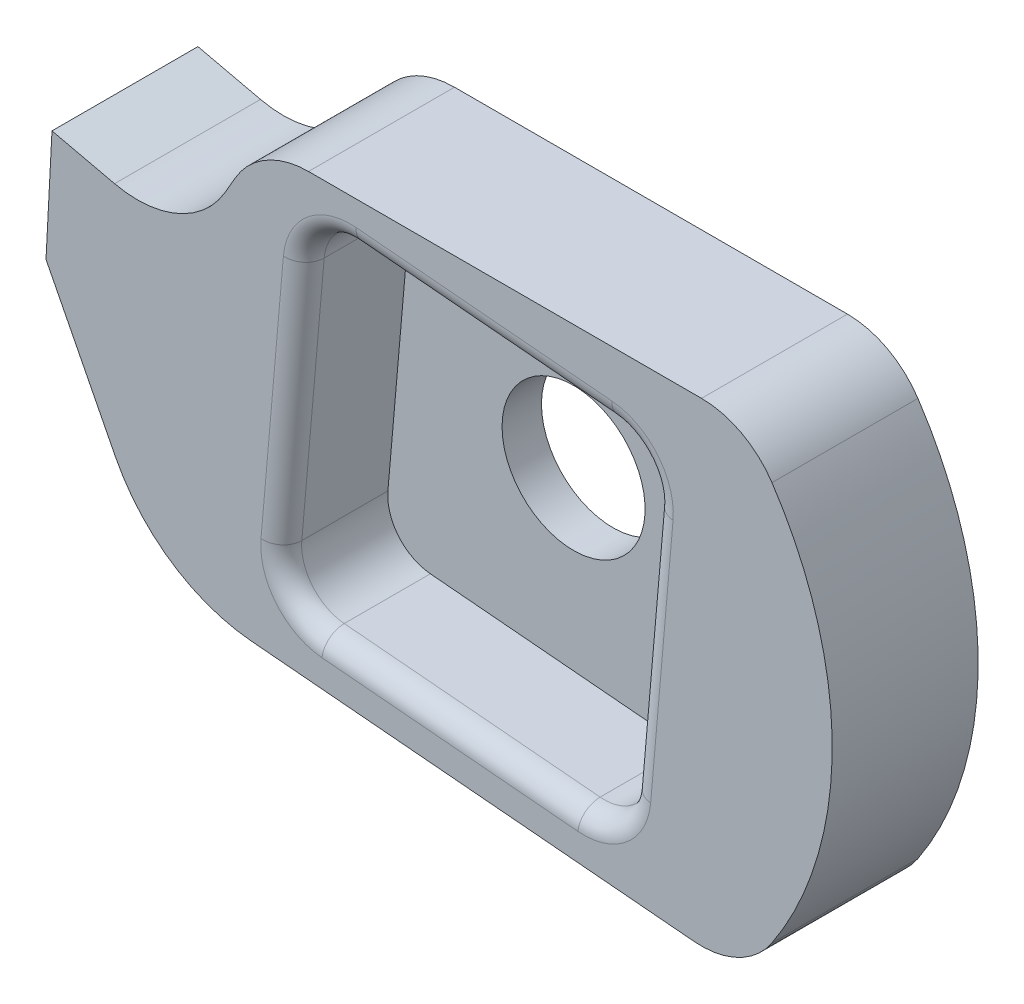
ISO-10303-21;
HEADER;
FILE_DESCRIPTION(('STEP AP214'),'2;1');
FILE_NAME('part.step','',(''),(''),'','','');
FILE_SCHEMA(('AUTOMOTIVE_DESIGN { 1 0 10303 214 1 1 1 1 }'));
ENDSEC;
DATA;
#1=APPLICATION_CONTEXT('core data for automotive mechanical design processes');
#2=APPLICATION_PROTOCOL_DEFINITION('international standard','automotive_design',2000,#1);
#3=PRODUCT_CONTEXT('',#1,'mechanical');
#4=PRODUCT('Part','Part','',(#3));
#5=PRODUCT_RELATED_PRODUCT_CATEGORY('part','',(#4));
#6=PRODUCT_DEFINITION_FORMATION('','',#4);
#7=PRODUCT_DEFINITION_CONTEXT('part definition',#1,'design');
#8=PRODUCT_DEFINITION('design','',#6,#7);
#9=PRODUCT_DEFINITION_SHAPE('','',#8);
#10=(LENGTH_UNIT() NAMED_UNIT(*) SI_UNIT(.MILLI.,.METRE.));
#11=(NAMED_UNIT(*) PLANE_ANGLE_UNIT() SI_UNIT($,.RADIAN.));
#12=(NAMED_UNIT(*) SI_UNIT($,.STERADIAN.) SOLID_ANGLE_UNIT());
#13=UNCERTAINTY_MEASURE_WITH_UNIT(LENGTH_MEASURE(1.E-05),#10,'distance_accuracy_value','');
#14=(GEOMETRIC_REPRESENTATION_CONTEXT(3) GLOBAL_UNCERTAINTY_ASSIGNED_CONTEXT((#13)) GLOBAL_UNIT_ASSIGNED_CONTEXT((#10,
#11,#12)) REPRESENTATION_CONTEXT('',''));
#15=CARTESIAN_POINT('',(0.,0.,0.));
#16=DIRECTION('',(0.,0.,1.));
#17=DIRECTION('',(1.,0.,0.));
#18=AXIS2_PLACEMENT_3D('',#15,#16,#17);
#19=CARTESIAN_POINT('',(-56.1580467501813,52.2,-50.));
#20=DIRECTION('',(0.,0.,1.));
#21=DIRECTION('',(-1.,0.,0.));
#22=AXIS2_PLACEMENT_3D('',#19,#20,#21);
#23=CYLINDRICAL_SURFACE('',#22,29.);
#24=CARTESIAN_POINT('',(-56.1580467501813,52.2,0.));
#25=DIRECTION('',(0.,0.,1.));
#26=DIRECTION('',(1.,0.,0.));
#27=AXIS2_PLACEMENT_3D('',#24,#25,#26);
#28=CIRCLE('',#27,29.);
#29=CARTESIAN_POINT('',(-56.1580467501813,81.2,0.));
#30=VERTEX_POINT('',#29);
#31=CARTESIAN_POINT('',(-81.2727834599301,66.6999999999999,0.));
#32=VERTEX_POINT('',#31);
#33=EDGE_CURVE('E250',#30,#32,#28,.T.);
#34=ORIENTED_EDGE('',*,*,#33,.F.);
#35=DIRECTION('',(0.,0.,1.));
#36=VECTOR('',#35,1.);
#37=CARTESIAN_POINT('',(-56.1580467501813,81.2,-50.));
#38=LINE('',#37,#36);
#39=CARTESIAN_POINT('',(-56.1580467501813,81.2,-50.));
#40=VERTEX_POINT('',#39);
#41=EDGE_CURVE('E300',#40,#30,#38,.T.);
#42=ORIENTED_EDGE('',*,*,#41,.F.);
#43=CARTESIAN_POINT('',(-56.1580467501813,52.2,-50.));
#44=DIRECTION('',(0.,0.,1.));
#45=DIRECTION('',(1.,0.,0.));
#46=AXIS2_PLACEMENT_3D('',#43,#44,#45);
#47=CIRCLE('',#46,29.);
#48=CARTESIAN_POINT('',(-81.2727834599301,66.6999999999999,-50.));
#49=VERTEX_POINT('',#48);
#50=EDGE_CURVE('E267',#40,#49,#47,.T.);
#51=ORIENTED_EDGE('',*,*,#50,.T.);
#52=DIRECTION('',(0.,0.,1.));
#53=VECTOR('',#52,1.);
#54=CARTESIAN_POINT('',(-81.2727834599301,66.6999999999999,-50.));
#55=LINE('',#54,#53);
#56=EDGE_CURVE('E363',#49,#32,#55,.T.);
#57=ORIENTED_EDGE('',*,*,#56,.T.);
#58=EDGE_LOOP('',(#34,#42,#51,#57));
#59=FACE_BOUND('',#58,.T.);
#60=ADVANCED_FACE('F39',(#59),#23,.T.);
#61=CARTESIAN_POINT('',(-81.2727834599301,66.6999999999999,-50.));
#62=DIRECTION('',(0.866025403784442,-0.499999999999994,0.));
#63=DIRECTION('',(0.499999999999994,0.866025403784442,0.));
#64=AXIS2_PLACEMENT_3D('',#61,#62,#63);
#65=PLANE('',#64);
#66=DIRECTION('',(-0.499999999999994,-0.866025403784442,0.));
#67=VECTOR('',#66,1.);
#68=CARTESIAN_POINT('',(-81.2727834599301,66.6999999999999,0.));
#69=LINE('',#68,#67);
#70=CARTESIAN_POINT('',(-84.6449968589336,60.8591550589612,0.));
#71=VERTEX_POINT('',#70);
#72=EDGE_CURVE('E303',#32,#71,#69,.T.);
#73=ORIENTED_EDGE('',*,*,#72,.F.);
#74=ORIENTED_EDGE('',*,*,#56,.F.);
#75=DIRECTION('',(-0.499999999999994,-0.866025403784442,0.));
#76=VECTOR('',#75,1.);
#77=CARTESIAN_POINT('',(-81.2727834599301,66.6999999999999,-50.));
#78=LINE('',#77,#76);
#79=CARTESIAN_POINT('',(-84.6449968589336,60.8591550589612,-50.));
#80=VERTEX_POINT('',#79);
#81=EDGE_CURVE('E270',#49,#80,#78,.T.);
#82=ORIENTED_EDGE('',*,*,#81,.T.);
#83=DIRECTION('',(0.,0.,1.));
#84=VECTOR('',#83,1.);
#85=CARTESIAN_POINT('',(-84.6449968589336,60.8591550589612,-50.));
#86=LINE('',#85,#84);
#87=EDGE_CURVE('E360',#80,#71,#86,.T.);
#88=ORIENTED_EDGE('',*,*,#87,.T.);
#89=EDGE_LOOP('',(#73,#74,#82,#88));
#90=FACE_BOUND('',#89,.T.);
#91=ADVANCED_FACE('F466',(#90),#65,.F.);
#92=CARTESIAN_POINT('',(-114.782680910632,78.259155058961,-50.));
#93=DIRECTION('',(0.,0.,1.));
#94=DIRECTION('',(-1.,0.,0.));
#95=AXIS2_PLACEMENT_3D('',#92,#93,#94);
#96=CYLINDRICAL_SURFACE('',#95,34.8);
#97=CARTESIAN_POINT('',(-114.782680910632,78.259155058961,0.));
#98=DIRECTION('',(0.,0.,1.));
#99=DIRECTION('',(1.,0.,0.));
#100=AXIS2_PLACEMENT_3D('',#97,#98,#99);
#101=CIRCLE('',#100,34.8);
#102=CARTESIAN_POINT('',(-122.610977601799,44.3510768044349,0.));
#103=VERTEX_POINT('',#102);
#104=EDGE_CURVE('E306',#103,#71,#101,.T.);
#105=ORIENTED_EDGE('',*,*,#104,.T.);
#106=ORIENTED_EDGE('',*,*,#87,.F.);
#107=CARTESIAN_POINT('',(-114.782680910632,78.259155058961,-50.));
#108=DIRECTION('',(0.,0.,1.));
#109=DIRECTION('',(1.,0.,0.));
#110=AXIS2_PLACEMENT_3D('',#107,#108,#109);
#111=CIRCLE('',#110,34.8);
#112=CARTESIAN_POINT('',(-122.610977601799,44.3510768044349,-50.));
#113=VERTEX_POINT('',#112);
#114=EDGE_CURVE('E274',#113,#80,#111,.T.);
#115=ORIENTED_EDGE('',*,*,#114,.F.);
#116=DIRECTION('',(0.,0.,1.));
#117=VECTOR('',#116,1.);
#118=CARTESIAN_POINT('',(-122.610977601799,44.3510768044349,-50.));
#119=LINE('',#118,#117);
#120=EDGE_CURVE('E357',#113,#103,#119,.T.);
#121=ORIENTED_EDGE('',*,*,#120,.T.);
#122=EDGE_LOOP('',(#105,#106,#115,#121));
#123=FACE_BOUND('',#122,.T.);
#124=ADVANCED_FACE('F464',(#123),#96,.F.);
#125=CARTESIAN_POINT('',(-122.610977601799,44.3510768044349,-50.));
#126=DIRECTION('',(-0.224951054343867,-0.974370064785235,0.));
#127=DIRECTION('',(0.974370064785235,-0.224951054343868,0.));
#128=AXIS2_PLACEMENT_3D('',#125,#126,#127);
#129=PLANE('',#128);
#130=DIRECTION('',(-0.974370064785235,0.224951054343868,0.));
#131=VECTOR('',#130,1.);
#132=CARTESIAN_POINT('',(-122.610977601799,44.3510768044349,0.));
#133=LINE('',#132,#131);
#134=CARTESIAN_POINT('',(-144.047119027074,49.3,0.));
#135=VERTEX_POINT('',#134);
#136=EDGE_CURVE('E308',#103,#135,#133,.T.);
#137=ORIENTED_EDGE('',*,*,#136,.F.);
#138=ORIENTED_EDGE('',*,*,#120,.F.);
#139=DIRECTION('',(-0.974370064785235,0.224951054343868,0.));
#140=VECTOR('',#139,1.);
#141=CARTESIAN_POINT('',(-122.610977601799,44.3510768044349,-50.));
#142=LINE('',#141,#140);
#143=CARTESIAN_POINT('',(-144.047119027074,49.3,-50.));
#144=VERTEX_POINT('',#143);
#145=EDGE_CURVE('E276',#113,#144,#142,.T.);
#146=ORIENTED_EDGE('',*,*,#145,.T.);
#147=DIRECTION('',(0.,0.,1.));
#148=VECTOR('',#147,1.);
#149=CARTESIAN_POINT('',(-144.047119027074,49.3,-50.));
#150=LINE('',#149,#148);
#151=EDGE_CURVE('E354',#144,#135,#150,.T.);
#152=ORIENTED_EDGE('',*,*,#151,.T.);
#153=EDGE_LOOP('',(#137,#138,#146,#152));
#154=FACE_BOUND('',#153,.T.);
#155=ADVANCED_FACE('F461',(#154),#129,.F.);
#156=CARTESIAN_POINT('',(-144.047119027074,49.3,-50.));
#157=DIRECTION('',(0.998629534754573,-0.0523359562429548,0.));
#158=DIRECTION('',(0.0523359562429549,0.998629534754574,0.));
#159=AXIS2_PLACEMENT_3D('',#156,#157,#158);
#160=PLANE('',#159);
#161=DIRECTION('',(-0.0523359562429548,-0.998629534754573,0.));
#162=VECTOR('',#161,1.);
#163=CARTESIAN_POINT('',(-144.047119027074,49.3,0.));
#164=LINE('',#163,#162);
#165=CARTESIAN_POINT('',(-146.098883586005,10.15,0.));
#166=VERTEX_POINT('',#165);
#167=EDGE_CURVE('E311',#135,#166,#164,.T.);
#168=ORIENTED_EDGE('',*,*,#167,.F.);
#169=ORIENTED_EDGE('',*,*,#151,.F.);
#170=DIRECTION('',(-0.0523359562429548,-0.998629534754573,0.));
#171=VECTOR('',#170,1.);
#172=CARTESIAN_POINT('',(-144.047119027074,49.3,-50.));
#173=LINE('',#172,#171);
#174=CARTESIAN_POINT('',(-146.098883586005,10.15,-50.));
#175=VERTEX_POINT('',#174);
#176=EDGE_CURVE('E279',#144,#175,#173,.T.);
#177=ORIENTED_EDGE('',*,*,#176,.T.);
#178=DIRECTION('',(0.,0.,1.));
#179=VECTOR('',#178,1.);
#180=CARTESIAN_POINT('',(-146.098883586005,10.15,-50.));
#181=LINE('',#180,#179);
#182=EDGE_CURVE('E351',#175,#166,#181,.T.);
#183=ORIENTED_EDGE('',*,*,#182,.T.);
#184=EDGE_LOOP('',(#168,#169,#177,#183));
#185=FACE_BOUND('',#184,.T.);
#186=ADVANCED_FACE('F456',(#185),#160,.F.);
#187=CARTESIAN_POINT('',(-146.098883586005,10.15,-50.));
#188=DIRECTION('',(0.891006524188372,0.453990499739539,0.));
#189=DIRECTION('',(-0.453990499739539,0.891006524188372,0.));
#190=AXIS2_PLACEMENT_3D('',#187,#188,#189);
#191=PLANE('',#190);
#192=DIRECTION('',(0.453990499739538,-0.891006524188372,0.));
#193=VECTOR('',#192,1.);
#194=CARTESIAN_POINT('',(-146.098883586005,10.15,0.));
#195=LINE('',#194,#193);
#196=CARTESIAN_POINT('',(-122.33449706401,-36.4902346449542,0.));
#197=VERTEX_POINT('',#196);
#198=EDGE_CURVE('E314',#166,#197,#195,.T.);
#199=ORIENTED_EDGE('',*,*,#198,.F.);
#200=ORIENTED_EDGE('',*,*,#182,.F.);
#201=DIRECTION('',(0.453990499739538,-0.891006524188372,0.));
#202=VECTOR('',#201,1.);
#203=CARTESIAN_POINT('',(-146.098883586005,10.15,-50.));
#204=LINE('',#203,#202);
#205=CARTESIAN_POINT('',(-122.33449706401,-36.4902346449542,-50.));
#206=VERTEX_POINT('',#205);
#207=EDGE_CURVE('E282',#175,#206,#204,.T.);
#208=ORIENTED_EDGE('',*,*,#207,.T.);
#209=DIRECTION('',(0.,0.,1.));
#210=VECTOR('',#209,1.);
#211=CARTESIAN_POINT('',(-122.33449706401,-36.4902346449542,-50.));
#212=LINE('',#211,#210);
#213=EDGE_CURVE('E348',#206,#197,#212,.T.);
#214=ORIENTED_EDGE('',*,*,#213,.T.);
#215=EDGE_LOOP('',(#199,#200,#208,#214));
#216=FACE_BOUND('',#215,.T.);
#217=ADVANCED_FACE('F453',(#216),#191,.F.);
#218=CARTESIAN_POINT('',(-70.6561186610845,-10.158785660061,-50.));
#219=DIRECTION('',(0.,0.,1.));
#220=DIRECTION('',(-1.,0.,0.));
#221=AXIS2_PLACEMENT_3D('',#218,#219,#220);
#222=CYLINDRICAL_SURFACE('',#221,58.);
#223=CARTESIAN_POINT('',(-70.6561186610845,-10.158785660061,0.));
#224=DIRECTION('',(0.,0.,1.));
#225=DIRECTION('',(1.,0.,0.));
#226=AXIS2_PLACEMENT_3D('',#223,#224,#225);
#227=CIRCLE('',#226,58.);
#228=CARTESIAN_POINT('',(-75.7111517404487,-67.9380781493822,0.));
#229=VERTEX_POINT('',#228);
#230=EDGE_CURVE('E317',#197,#229,#227,.T.);
#231=ORIENTED_EDGE('',*,*,#230,.F.);
#232=ORIENTED_EDGE('',*,*,#213,.F.);
#233=CARTESIAN_POINT('',(-70.6561186610845,-10.158785660061,-50.));
#234=DIRECTION('',(0.,0.,1.));
#235=DIRECTION('',(1.,0.,0.));
#236=AXIS2_PLACEMENT_3D('',#233,#234,#235);
#237=CIRCLE('',#236,58.);
#238=CARTESIAN_POINT('',(-75.7111517404487,-67.9380781493822,-50.));
#239=VERTEX_POINT('',#238);
#240=EDGE_CURVE('E285',#206,#239,#237,.T.);
#241=ORIENTED_EDGE('',*,*,#240,.T.);
#242=DIRECTION('',(0.,0.,1.));
#243=VECTOR('',#242,1.);
#244=CARTESIAN_POINT('',(-75.7111517404487,-67.9380781493822,-50.));
#245=LINE('',#244,#243);
#246=EDGE_CURVE('E345',#239,#229,#245,.T.);
#247=ORIENTED_EDGE('',*,*,#246,.T.);
#248=EDGE_LOOP('',(#231,#232,#241,#247));
#249=FACE_BOUND('',#248,.T.);
#250=ADVANCED_FACE('F451',(#249),#222,.T.);
#251=CARTESIAN_POINT('',(-75.7111517404487,-67.9380781493822,-50.));
#252=DIRECTION('',(0.0871557427476582,0.996194698091746,0.));
#253=DIRECTION('',(-0.996194698091746,0.0871557427476582,0.));
#254=AXIS2_PLACEMENT_3D('',#251,#252,#253);
#255=PLANE('',#254);
#256=DIRECTION('',(0.996194698091746,-0.0871557427476582,0.));
#257=VECTOR('',#256,1.);
#258=CARTESIAN_POINT('',(-75.7111517404487,-67.9380781493822,0.));
#259=LINE('',#258,#257);
#260=CARTESIAN_POINT('',(75.873308647246,-81.2,0.));
#261=VERTEX_POINT('',#260);
#262=EDGE_CURVE('E320',#229,#261,#259,.T.);
#263=ORIENTED_EDGE('',*,*,#262,.F.);
#264=ORIENTED_EDGE('',*,*,#246,.F.);
#265=DIRECTION('',(0.996194698091746,-0.0871557427476582,0.));
#266=VECTOR('',#265,1.);
#267=CARTESIAN_POINT('',(-75.7111517404487,-67.9380781493822,-50.));
#268=LINE('',#267,#266);
#269=CARTESIAN_POINT('',(75.873308647246,-81.2,-50.));
#270=VERTEX_POINT('',#269);
#271=EDGE_CURVE('E288',#239,#270,#268,.T.);
#272=ORIENTED_EDGE('',*,*,#271,.T.);
#273=DIRECTION('',(0.,0.,1.));
#274=VECTOR('',#273,1.);
#275=CARTESIAN_POINT('',(75.873308647246,-81.2,-50.));
#276=LINE('',#275,#274);
#277=EDGE_CURVE('E342',#270,#261,#276,.T.);
#278=ORIENTED_EDGE('',*,*,#277,.T.);
#279=EDGE_LOOP('',(#263,#264,#272,#278));
#280=FACE_BOUND('',#279,.T.);
#281=ADVANCED_FACE('F447',(#280),#255,.F.);
#282=CARTESIAN_POINT('',(78.400825186928,-52.3103537553394,-50.));
#283=DIRECTION('',(0.,0.,1.));
#284=DIRECTION('',(-1.,0.,0.));
#285=AXIS2_PLACEMENT_3D('',#282,#283,#284);
#286=CYLINDRICAL_SURFACE('',#285,29.);
#287=CARTESIAN_POINT('',(78.400825186928,-52.3103537553394,0.));
#288=DIRECTION('',(0.,0.,1.));
#289=DIRECTION('',(1.,0.,0.));
#290=AXIS2_PLACEMENT_3D('',#287,#288,#289);
#291=CIRCLE('',#290,29.);
#292=CARTESIAN_POINT('',(102.524156013675,-68.4058472185207,0.));
#293=VERTEX_POINT('',#292);
#294=EDGE_CURVE('E323',#261,#293,#291,.T.);
#295=ORIENTED_EDGE('',*,*,#294,.F.);
#296=ORIENTED_EDGE('',*,*,#277,.F.);
#297=CARTESIAN_POINT('',(78.400825186928,-52.3103537553394,-50.));
#298=DIRECTION('',(0.,0.,1.));
#299=DIRECTION('',(1.,0.,0.));
#300=AXIS2_PLACEMENT_3D('',#297,#298,#299);
#301=CIRCLE('',#300,29.);
#302=CARTESIAN_POINT('',(102.524156013675,-68.4058472185207,-50.));
#303=VERTEX_POINT('',#302);
#304=EDGE_CURVE('E291',#270,#303,#301,.T.);
#305=ORIENTED_EDGE('',*,*,#304,.T.);
#306=DIRECTION('',(0.,0.,1.));
#307=VECTOR('',#306,1.);
#308=CARTESIAN_POINT('',(102.524156013675,-68.4058472185207,-50.));
#309=LINE('',#308,#307);
#310=EDGE_CURVE('E339',#303,#293,#309,.T.);
#311=ORIENTED_EDGE('',*,*,#310,.T.);
#312=EDGE_LOOP('',(#295,#296,#305,#311));
#313=FACE_BOUND('',#312,.T.);
#314=ADVANCED_FACE('F444',(#313),#286,.T.);
#315=CARTESIAN_POINT('',(0.,0.,-50.));
#316=DIRECTION('',(0.,0.,1.));
#317=DIRECTION('',(-1.,0.,0.));
#318=AXIS2_PLACEMENT_3D('',#315,#316,#317);
#319=CYLINDRICAL_SURFACE('',#318,123.25);
#320=CARTESIAN_POINT('',(0.,0.,0.));
#321=DIRECTION('',(0.,0.,-1.));
#322=DIRECTION('',(-1.,0.,0.));
#323=AXIS2_PLACEMENT_3D('',#320,#321,#322);
#324=CIRCLE('',#323,123.25);
#325=CARTESIAN_POINT('',(102.620294614973,68.2615384615384,0.));
#326=VERTEX_POINT('',#325);
#327=EDGE_CURVE('E326',#326,#293,#324,.T.);
#328=ORIENTED_EDGE('',*,*,#327,.T.);
#329=ORIENTED_EDGE('',*,*,#310,.F.);
#330=CARTESIAN_POINT('',(0.,0.,-50.));
#331=DIRECTION('',(0.,0.,-1.));
#332=DIRECTION('',(-1.,0.,0.));
#333=AXIS2_PLACEMENT_3D('',#330,#331,#332);
#334=CIRCLE('',#333,123.25);
#335=CARTESIAN_POINT('',(102.620294614973,68.2615384615384,-50.));
#336=VERTEX_POINT('',#335);
#337=EDGE_CURVE('E294',#336,#303,#334,.T.);
#338=ORIENTED_EDGE('',*,*,#337,.F.);
#339=DIRECTION('',(0.,0.,1.));
#340=VECTOR('',#339,1.);
#341=CARTESIAN_POINT('',(102.620294614973,68.2615384615384,-50.));
#342=LINE('',#341,#340);
#343=EDGE_CURVE('E336',#336,#326,#342,.T.);
#344=ORIENTED_EDGE('',*,*,#343,.T.);
#345=EDGE_LOOP('',(#328,#329,#338,#344));
#346=FACE_BOUND('',#345,.T.);
#347=ADVANCED_FACE('F441',(#346),#319,.T.);
#348=CARTESIAN_POINT('',(78.4743429408619,52.2,-50.));
#349=DIRECTION('',(0.,0.,1.));
#350=DIRECTION('',(-1.,0.,0.));
#351=AXIS2_PLACEMENT_3D('',#348,#349,#350);
#352=CYLINDRICAL_SURFACE('',#351,29.);
#353=CARTESIAN_POINT('',(78.4743429408619,52.2,0.));
#354=DIRECTION('',(0.,0.,-1.));
#355=DIRECTION('',(-1.,0.,0.));
#356=AXIS2_PLACEMENT_3D('',#353,#354,#355);
#357=CIRCLE('',#356,29.);
#358=CARTESIAN_POINT('',(78.4743429408619,81.2,0.));
#359=VERTEX_POINT('',#358);
#360=EDGE_CURVE('E328',#359,#326,#357,.T.);
#361=ORIENTED_EDGE('',*,*,#360,.T.);
#362=ORIENTED_EDGE('',*,*,#343,.F.);
#363=CARTESIAN_POINT('',(78.4743429408619,52.2,-50.));
#364=DIRECTION('',(0.,0.,-1.));
#365=DIRECTION('',(-1.,0.,0.));
#366=AXIS2_PLACEMENT_3D('',#363,#364,#365);
#367=CIRCLE('',#366,29.);
#368=CARTESIAN_POINT('',(78.4743429408619,81.2,-50.));
#369=VERTEX_POINT('',#368);
#370=EDGE_CURVE('E296',#369,#336,#367,.T.);
#371=ORIENTED_EDGE('',*,*,#370,.F.);
#372=DIRECTION('',(0.,0.,1.));
#373=VECTOR('',#372,1.);
#374=CARTESIAN_POINT('',(78.4743429408619,81.2,-50.));
#375=LINE('',#374,#373);
#376=EDGE_CURVE('E333',#369,#359,#375,.T.);
#377=ORIENTED_EDGE('',*,*,#376,.T.);
#378=EDGE_LOOP('',(#361,#362,#371,#377));
#379=FACE_BOUND('',#378,.T.);
#380=ADVANCED_FACE('F436',(#379),#352,.T.);
#381=CARTESIAN_POINT('',(-56.1580467501813,81.2,-50.));
#382=DIRECTION('',(0.,1.,0.));
#383=DIRECTION('',(-1.,0.,0.));
#384=AXIS2_PLACEMENT_3D('',#381,#382,#383);
#385=PLANE('',#384);
#386=DIRECTION('',(1.,0.,0.));
#387=VECTOR('',#386,1.);
#388=CARTESIAN_POINT('',(-56.1580467501813,81.2,0.));
#389=LINE('',#388,#387);
#390=EDGE_CURVE('E271',#30,#359,#389,.T.);
#391=ORIENTED_EDGE('',*,*,#390,.T.);
#392=ORIENTED_EDGE('',*,*,#376,.F.);
#393=DIRECTION('',(1.,0.,0.));
#394=VECTOR('',#393,1.);
#395=CARTESIAN_POINT('',(-56.1580467501813,81.2,-50.));
#396=LINE('',#395,#394);
#397=EDGE_CURVE('E298',#40,#369,#396,.T.);
#398=ORIENTED_EDGE('',*,*,#397,.F.);
#399=ORIENTED_EDGE('',*,*,#41,.T.);
#400=EDGE_LOOP('',(#391,#392,#398,#399));
#401=FACE_BOUND('',#400,.T.);
#402=ADVANCED_FACE('F423',(#401),#385,.T.);
#403=CARTESIAN_POINT('',(-56.1580467501813,52.2,-50.));
#404=DIRECTION('',(0.,0.,-1.));
#405=DIRECTION('',(1.,0.,0.));
#406=AXIS2_PLACEMENT_3D('',#403,#404,#405);
#407=PLANE('',#406);
#408=CARTESIAN_POINT('',(-1.85842786919295,2.13502946247841,-50.));
#409=DIRECTION('',(0.,0.,-1.));
#410=DIRECTION('',(-1.,0.,0.));
#411=AXIS2_PLACEMENT_3D('',#408,#409,#410);
#412=CIRCLE('',#411,24.5);
#413=CARTESIAN_POINT('',(-26.358427869193,2.13502946247841,-50.));
#414=VERTEX_POINT('',#413);
#415=EDGE_CURVE('E233',#414,#414,#412,.T.);
#416=ORIENTED_EDGE('',*,*,#415,.F.);
#417=EDGE_LOOP('',(#416));
#418=FACE_BOUND('',#417,.T.);
#419=ORIENTED_EDGE('',*,*,#50,.F.);
#420=ORIENTED_EDGE('',*,*,#397,.T.);
#421=ORIENTED_EDGE('',*,*,#370,.T.);
#422=ORIENTED_EDGE('',*,*,#337,.T.);
#423=ORIENTED_EDGE('',*,*,#304,.F.);
#424=ORIENTED_EDGE('',*,*,#271,.F.);
#425=ORIENTED_EDGE('',*,*,#240,.F.);
#426=ORIENTED_EDGE('',*,*,#207,.F.);
#427=ORIENTED_EDGE('',*,*,#176,.F.);
#428=ORIENTED_EDGE('',*,*,#145,.F.);
#429=ORIENTED_EDGE('',*,*,#114,.T.);
#430=ORIENTED_EDGE('',*,*,#81,.F.);
#431=EDGE_LOOP('',(#419,#420,#421,#422,#423,#424,#425,#426,#427,#428,#429,#430));
#432=FACE_BOUND('',#431,.T.);
#433=ADVANCED_FACE('F419',(#418,#432),#407,.T.);
#434=CARTESIAN_POINT('',(-56.1580467501813,52.2,0.));
#435=DIRECTION('',(0.,0.,-1.));
#436=DIRECTION('',(1.,0.,0.));
#437=AXIS2_PLACEMENT_3D('',#434,#435,#436);
#438=PLANE('',#437);
#439=DIRECTION('',(-0.0871557427476587,-0.996194698091746,0.));
#440=VECTOR('',#439,1.);
#441=CARTESIAN_POINT('',(68.8209957416571,41.2657506036393,0.));
#442=LINE('',#441,#440);
#443=CARTESIAN_POINT('',(61.051764222057,-47.5369720176515,0.));
#444=VERTEX_POINT('',#443);
#445=CARTESIAN_POINT('',(68.721469583851,40.1281614144221,0.));
#446=VERTEX_POINT('',#445);
#447=EDGE_CURVE('E384',#444,#446,#442,.F.);
#448=ORIENTED_EDGE('',*,*,#447,.F.);
#449=CARTESIAN_POINT('',(38.1392861659469,-45.5323899344554,0.));
#450=DIRECTION('',(0.,0.,1.));
#451=DIRECTION('',(1.,0.,0.));
#452=AXIS2_PLACEMENT_3D('',#449,#450,#451);
#453=CIRCLE('',#452,23.);
#454=CARTESIAN_POINT('',(36.1347040827507,-68.4448679905655,0.));
#455=VERTEX_POINT('',#454);
#456=EDGE_CURVE('E381',#455,#444,#453,.T.);
#457=ORIENTED_EDGE('',*,*,#456,.F.);
#458=DIRECTION('',(-0.996194698091746,0.0871557427476585,0.));
#459=VECTOR('',#458,1.);
#460=CARTESIAN_POINT('',(-65.9318603529776,-59.515200677401,0.));
#461=LINE('',#460,#459);
#462=CARTESIAN_POINT('',(-51.5304293493229,-60.7751626287716,0.));
#463=VERTEX_POINT('',#462);
#464=EDGE_CURVE('E378',#463,#455,#461,.F.);
#465=ORIENTED_EDGE('',*,*,#464,.F.);
#466=CARTESIAN_POINT('',(-49.5258472661268,-37.8626845726614,0.));
#467=DIRECTION('',(0.,0.,1.));
#468=DIRECTION('',(1.,0.,0.));
#469=AXIS2_PLACEMENT_3D('',#466,#467,#468);
#470=CIRCLE('',#469,23.);
#471=CARTESIAN_POINT('',(-72.4383253222369,-35.8581024894653,0.));
#472=VERTEX_POINT('',#471);
#473=EDGE_CURVE('E375',#472,#463,#470,.T.);
#474=ORIENTED_EDGE('',*,*,#473,.F.);
#475=DIRECTION('',(-0.087155742747659,-0.996194698091746,0.));
#476=VECTOR('',#475,1.);
#477=CARTESIAN_POINT('',(-72.4383253222369,-35.8581024894653,0.));
#478=LINE('',#477,#476);
#479=CARTESIAN_POINT('',(-64.7686199604429,51.8070309426084,0.));
#480=VERTEX_POINT('',#479);
#481=EDGE_CURVE('E372',#480,#472,#478,.T.);
#482=ORIENTED_EDGE('',*,*,#481,.F.);
#483=CARTESIAN_POINT('',(-41.8561419043328,49.8024488594122,0.));
#484=DIRECTION('',(0.,0.,1.));
#485=DIRECTION('',(1.,0.,0.));
#486=AXIS2_PLACEMENT_3D('',#483,#484,#485);
#487=CIRCLE('',#486,23.);
#488=CARTESIAN_POINT('',(-39.8515598211366,72.7149269155224,0.));
#489=VERTEX_POINT('',#488);
#490=EDGE_CURVE('E370',#489,#480,#487,.T.);
#491=ORIENTED_EDGE('',*,*,#490,.F.);
#492=DIRECTION('',(-0.996194698091746,0.0871557427476588,0.));
#493=VECTOR('',#492,1.);
#494=CARTESIAN_POINT('',(-39.8515598211366,72.7149269155224,0.));
#495=LINE('',#494,#493);
#496=CARTESIAN_POINT('',(47.813573610937,65.0452215537284,0.));
#497=VERTEX_POINT('',#496);
#498=EDGE_CURVE('E368',#497,#489,#495,.T.);
#499=ORIENTED_EDGE('',*,*,#498,.F.);
#500=CARTESIAN_POINT('',(45.8089915277408,42.1327434976183,0.));
#501=DIRECTION('',(0.,0.,1.));
#502=DIRECTION('',(1.,0.,0.));
#503=AXIS2_PLACEMENT_3D('',#500,#501,#502);
#504=CIRCLE('',#503,23.);
#505=EDGE_CURVE('E387',#446,#497,#504,.T.);
#506=ORIENTED_EDGE('',*,*,#505,.F.);
#507=EDGE_LOOP('',(#448,#457,#465,#474,#482,#491,#499,#506));
#508=FACE_BOUND('',#507,.T.);
#509=ORIENTED_EDGE('',*,*,#33,.T.);
#510=ORIENTED_EDGE('',*,*,#72,.T.);
#511=ORIENTED_EDGE('',*,*,#104,.F.);
#512=ORIENTED_EDGE('',*,*,#136,.T.);
#513=ORIENTED_EDGE('',*,*,#167,.T.);
#514=ORIENTED_EDGE('',*,*,#198,.T.);
#515=ORIENTED_EDGE('',*,*,#230,.T.);
#516=ORIENTED_EDGE('',*,*,#262,.T.);
#517=ORIENTED_EDGE('',*,*,#294,.T.);
#518=ORIENTED_EDGE('',*,*,#327,.F.);
#519=ORIENTED_EDGE('',*,*,#360,.F.);
#520=ORIENTED_EDGE('',*,*,#390,.F.);
#521=EDGE_LOOP('',(#509,#510,#511,#512,#513,#514,#515,#516,#517,#518,#519,#520));
#522=FACE_BOUND('',#521,.T.);
#523=ADVANCED_FACE('F422',(#508,#522),#438,.F.);
#524=CARTESIAN_POINT('',(45.8089915277408,42.1327434976183,-36.5));
#525=DIRECTION('',(0.,0.,1.));
#526=DIRECTION('',(-1.,0.,0.));
#527=AXIS2_PLACEMENT_3D('',#524,#525,#526);
#528=CYLINDRICAL_SURFACE('',#527,16.);
#529=DIRECTION('',(0.,0.,1.));
#530=VECTOR('',#529,1.);
#531=CARTESIAN_POINT('',(47.2034834117034,58.0718586670862,-36.5));
#532=LINE('',#531,#530);
#533=CARTESIAN_POINT('',(47.2034834117034,58.0718586670862,-36.5));
#534=VERTEX_POINT('',#533);
#535=CARTESIAN_POINT('',(47.2034834117034,58.0718586670862,-7.));
#536=VERTEX_POINT('',#535);
#537=EDGE_CURVE('E229',#534,#536,#532,.T.);
#538=ORIENTED_EDGE('',*,*,#537,.F.);
#539=CARTESIAN_POINT('',(45.8089915277408,42.1327434976183,-36.5));
#540=DIRECTION('',(0.,0.,-1.));
#541=DIRECTION('',(-1.,0.,0.));
#542=AXIS2_PLACEMENT_3D('',#539,#540,#541);
#543=CIRCLE('',#542,16.);
#544=CARTESIAN_POINT('',(61.7481066972087,40.7382516136557,-36.5));
#545=VERTEX_POINT('',#544);
#546=EDGE_CURVE('E207',#534,#545,#543,.T.);
#547=ORIENTED_EDGE('',*,*,#546,.T.);
#548=DIRECTION('',(0.,0.,1.));
#549=VECTOR('',#548,1.);
#550=CARTESIAN_POINT('',(61.7481066972087,40.7382516136557,-36.5));
#551=LINE('',#550,#549);
#552=CARTESIAN_POINT('',(61.7481066972087,40.7382516136557,-7.));
#553=VERTEX_POINT('',#552);
#554=EDGE_CURVE('E217',#545,#553,#551,.T.);
#555=ORIENTED_EDGE('',*,*,#554,.T.);
#556=CARTESIAN_POINT('',(45.8089915277408,42.1327434976183,-7.));
#557=DIRECTION('',(0.,0.,1.));
#558=DIRECTION('',(1.,0.,0.));
#559=AXIS2_PLACEMENT_3D('',#556,#557,#558);
#560=CIRCLE('',#559,16.);
#561=EDGE_CURVE('E365',#536,#553,#560,.F.);
#562=ORIENTED_EDGE('',*,*,#561,.F.);
#563=EDGE_LOOP('',(#538,#547,#555,#562));
#564=FACE_BOUND('',#563,.T.);
#565=ADVANCED_FACE('F227',(#564),#528,.F.);
#566=CARTESIAN_POINT('',(47.2034834117034,58.0718586670862,-36.5));
#567=DIRECTION('',(-0.0871557427476588,-0.996194698091746,0.));
#568=DIRECTION('',(0.996194698091746,-0.0871557427476588,0.));
#569=AXIS2_PLACEMENT_3D('',#566,#567,#568);
#570=PLANE('',#569);
#571=DIRECTION('',(0.,0.,1.));
#572=VECTOR('',#571,1.);
#573=CARTESIAN_POINT('',(-40.4616500203702,65.7415640288801,-36.5));
#574=LINE('',#573,#572);
#575=CARTESIAN_POINT('',(-40.4616500203702,65.7415640288801,-36.5));
#576=VERTEX_POINT('',#575);
#577=CARTESIAN_POINT('',(-40.4616500203702,65.7415640288801,-7.));
#578=VERTEX_POINT('',#577);
#579=EDGE_CURVE('E251',#576,#578,#574,.T.);
#580=ORIENTED_EDGE('',*,*,#579,.F.);
#581=DIRECTION('',(-0.996194698091745,0.0871557427476588,0.));
#582=VECTOR('',#581,1.);
#583=CARTESIAN_POINT('',(47.2034834117034,58.0718586670862,-36.5));
#584=LINE('',#583,#582);
#585=EDGE_CURVE('E225',#534,#576,#584,.T.);
#586=ORIENTED_EDGE('',*,*,#585,.F.);
#587=ORIENTED_EDGE('',*,*,#537,.T.);
#588=DIRECTION('',(-0.996194698091746,0.0871557427476588,0.));
#589=VECTOR('',#588,1.);
#590=CARTESIAN_POINT('',(47.2034834117034,58.0718586670862,-7.));
#591=LINE('',#590,#589);
#592=EDGE_CURVE('E11',#578,#536,#591,.F.);
#593=ORIENTED_EDGE('',*,*,#592,.F.);
#594=EDGE_LOOP('',(#580,#586,#587,#593));
#595=FACE_BOUND('',#594,.T.);
#596=ADVANCED_FACE('F474',(#595),#570,.T.);
#597=CARTESIAN_POINT('',(-41.8561419043328,49.8024488594122,-36.5));
#598=DIRECTION('',(0.,0.,1.));
#599=DIRECTION('',(-1.,0.,0.));
#600=AXIS2_PLACEMENT_3D('',#597,#598,#599);
#601=CYLINDRICAL_SURFACE('',#600,16.);
#602=DIRECTION('',(0.,0.,1.));
#603=VECTOR('',#602,1.);
#604=CARTESIAN_POINT('',(-57.7952570738007,51.1969407433748,-36.5));
#605=LINE('',#604,#603);
#606=CARTESIAN_POINT('',(-57.7952570738007,51.1969407433748,-36.5));
#607=VERTEX_POINT('',#606);
#608=CARTESIAN_POINT('',(-57.7952570738007,51.1969407433748,-7.));
#609=VERTEX_POINT('',#608);
#610=EDGE_CURVE('E254',#607,#609,#605,.T.);
#611=ORIENTED_EDGE('',*,*,#610,.F.);
#612=CARTESIAN_POINT('',(-41.8561419043328,49.8024488594122,-36.5));
#613=DIRECTION('',(0.,0.,1.));
#614=DIRECTION('',(1.,0.,0.));
#615=AXIS2_PLACEMENT_3D('',#612,#613,#614);
#616=CIRCLE('',#615,16.);
#617=EDGE_CURVE('E245',#576,#607,#616,.T.);
#618=ORIENTED_EDGE('',*,*,#617,.F.);
#619=ORIENTED_EDGE('',*,*,#579,.T.);
#620=CARTESIAN_POINT('',(-41.8561419043328,49.8024488594122,-7.));
#621=DIRECTION('',(0.,0.,1.));
#622=DIRECTION('',(1.,0.,0.));
#623=AXIS2_PLACEMENT_3D('',#620,#621,#622);
#624=CIRCLE('',#623,16.);
#625=EDGE_CURVE('E48',#609,#578,#624,.F.);
#626=ORIENTED_EDGE('',*,*,#625,.F.);
#627=EDGE_LOOP('',(#611,#618,#619,#626));
#628=FACE_BOUND('',#627,.T.);
#629=ADVANCED_FACE('F528',(#628),#601,.F.);
#630=CARTESIAN_POINT('',(-57.7952570738007,51.1969407433748,-36.5));
#631=DIRECTION('',(0.996194698091746,-0.087155742747659,0.));
#632=DIRECTION('',(0.087155742747659,0.996194698091746,0.));
#633=AXIS2_PLACEMENT_3D('',#630,#631,#632);
#634=PLANE('',#633);
#635=DIRECTION('',(0.,0.,1.));
#636=VECTOR('',#635,1.);
#637=CARTESIAN_POINT('',(-65.4649624355947,-36.4681926886989,-36.5));
#638=LINE('',#637,#636);
#639=CARTESIAN_POINT('',(-65.4649624355947,-36.4681926886989,-36.5));
#640=VERTEX_POINT('',#639);
#641=CARTESIAN_POINT('',(-65.4649624355947,-36.4681926886989,-7.));
#642=VERTEX_POINT('',#641);
#643=EDGE_CURVE('E257',#640,#642,#638,.T.);
#644=ORIENTED_EDGE('',*,*,#643,.F.);
#645=DIRECTION('',(-0.087155742747659,-0.996194698091745,0.));
#646=VECTOR('',#645,1.);
#647=CARTESIAN_POINT('',(-57.7952570738007,51.1969407433748,-36.5));
#648=LINE('',#647,#646);
#649=EDGE_CURVE('E242',#607,#640,#648,.T.);
#650=ORIENTED_EDGE('',*,*,#649,.F.);
#651=ORIENTED_EDGE('',*,*,#610,.T.);
#652=DIRECTION('',(-0.087155742747659,-0.996194698091746,0.));
#653=VECTOR('',#652,1.);
#654=CARTESIAN_POINT('',(-57.7952570738007,51.1969407433748,-7.));
#655=LINE('',#654,#653);
#656=EDGE_CURVE('E400',#642,#609,#655,.F.);
#657=ORIENTED_EDGE('',*,*,#656,.F.);
#658=EDGE_LOOP('',(#644,#650,#651,#657));
#659=FACE_BOUND('',#658,.T.);
#660=ADVANCED_FACE('F522',(#659),#634,.T.);
#661=CARTESIAN_POINT('',(-49.5258472661268,-37.8626845726614,-36.5));
#662=DIRECTION('',(0.,0.,1.));
#663=DIRECTION('',(-1.,0.,0.));
#664=AXIS2_PLACEMENT_3D('',#661,#662,#663);
#665=CYLINDRICAL_SURFACE('',#664,16.);
#666=DIRECTION('',(0.,0.,1.));
#667=VECTOR('',#666,1.);
#668=CARTESIAN_POINT('',(-50.9203391500893,-53.8017997421294,-36.5));
#669=LINE('',#668,#667);
#670=CARTESIAN_POINT('',(-50.9203391500893,-53.8017997421294,-36.5));
#671=VERTEX_POINT('',#670);
#672=CARTESIAN_POINT('',(-50.9203391500893,-53.8017997421294,-7.));
#673=VERTEX_POINT('',#672);
#674=EDGE_CURVE('E260',#671,#673,#669,.T.);
#675=ORIENTED_EDGE('',*,*,#674,.F.);
#676=CARTESIAN_POINT('',(-49.5258472661268,-37.8626845726614,-36.5));
#677=DIRECTION('',(0.,0.,-1.));
#678=DIRECTION('',(-1.,0.,0.));
#679=AXIS2_PLACEMENT_3D('',#676,#677,#678);
#680=CIRCLE('',#679,16.);
#681=EDGE_CURVE('E240',#671,#640,#680,.T.);
#682=ORIENTED_EDGE('',*,*,#681,.T.);
#683=ORIENTED_EDGE('',*,*,#643,.T.);
#684=CARTESIAN_POINT('',(-49.5258472661268,-37.8626845726614,-7.));
#685=DIRECTION('',(0.,0.,1.));
#686=DIRECTION('',(1.,0.,0.));
#687=AXIS2_PLACEMENT_3D('',#684,#685,#686);
#688=CIRCLE('',#687,16.);
#689=EDGE_CURVE('E397',#673,#642,#688,.F.);
#690=ORIENTED_EDGE('',*,*,#689,.F.);
#691=EDGE_LOOP('',(#675,#682,#683,#690));
#692=FACE_BOUND('',#691,.T.);
#693=ADVANCED_FACE('F524',(#692),#665,.F.);
#694=CARTESIAN_POINT('',(36.7447942819843,-61.4715051039233,-36.5));
#695=DIRECTION('',(-0.0871557427476585,-0.996194698091746,0.));
#696=DIRECTION('',(0.996194698091746,-0.0871557427476585,0.));
#697=AXIS2_PLACEMENT_3D('',#694,#695,#696);
#698=PLANE('',#697);
#699=DIRECTION('',(0.,0.,1.));
#700=VECTOR('',#699,1.);
#701=CARTESIAN_POINT('',(36.7447942819843,-61.4715051039233,-36.5));
#702=LINE('',#701,#700);
#703=CARTESIAN_POINT('',(36.7447942819843,-61.4715051039233,-36.5));
#704=VERTEX_POINT('',#703);
#705=CARTESIAN_POINT('',(36.7447942819843,-61.4715051039233,-7.));
#706=VERTEX_POINT('',#705);
#707=EDGE_CURVE('E263',#704,#706,#702,.T.);
#708=ORIENTED_EDGE('',*,*,#707,.F.);
#709=DIRECTION('',(-0.996194698091746,0.0871557427476585,0.));
#710=VECTOR('',#709,1.);
#711=CARTESIAN_POINT('',(36.7447942819843,-61.4715051039233,-36.5));
#712=LINE('',#711,#710);
#713=EDGE_CURVE('E238',#704,#671,#712,.T.);
#714=ORIENTED_EDGE('',*,*,#713,.T.);
#715=ORIENTED_EDGE('',*,*,#674,.T.);
#716=DIRECTION('',(-0.996194698091746,0.0871557427476585,0.));
#717=VECTOR('',#716,1.);
#718=CARTESIAN_POINT('',(36.7447942819843,-61.4715051039233,-7.));
#719=LINE('',#718,#717);
#720=EDGE_CURVE('E394',#706,#673,#719,.T.);
#721=ORIENTED_EDGE('',*,*,#720,.F.);
#722=EDGE_LOOP('',(#708,#714,#715,#721));
#723=FACE_BOUND('',#722,.T.);
#724=ADVANCED_FACE('F539',(#723),#698,.F.);
#725=CARTESIAN_POINT('',(38.1392861659469,-45.5323899344554,-36.5));
#726=DIRECTION('',(0.,0.,1.));
#727=DIRECTION('',(-1.,0.,0.));
#728=AXIS2_PLACEMENT_3D('',#725,#726,#727);
#729=CYLINDRICAL_SURFACE('',#728,16.);
#730=DIRECTION('',(0.,0.,1.));
#731=VECTOR('',#730,1.);
#732=CARTESIAN_POINT('',(54.0784013354148,-46.9268818184179,-36.5));
#733=LINE('',#732,#731);
#734=CARTESIAN_POINT('',(54.0784013354148,-46.9268818184179,-36.5));
#735=VERTEX_POINT('',#734);
#736=CARTESIAN_POINT('',(54.0784013354148,-46.9268818184179,-7.));
#737=VERTEX_POINT('',#736);
#738=EDGE_CURVE('E224',#735,#737,#733,.T.);
#739=ORIENTED_EDGE('',*,*,#738,.F.);
#740=CARTESIAN_POINT('',(38.1392861659469,-45.5323899344554,-36.5));
#741=DIRECTION('',(0.,0.,-1.));
#742=DIRECTION('',(-1.,0.,0.));
#743=AXIS2_PLACEMENT_3D('',#740,#741,#742);
#744=CIRCLE('',#743,16.);
#745=EDGE_CURVE('E210',#735,#704,#744,.T.);
#746=ORIENTED_EDGE('',*,*,#745,.T.);
#747=ORIENTED_EDGE('',*,*,#707,.T.);
#748=CARTESIAN_POINT('',(38.1392861659469,-45.5323899344554,-7.));
#749=DIRECTION('',(0.,0.,1.));
#750=DIRECTION('',(1.,0.,0.));
#751=AXIS2_PLACEMENT_3D('',#748,#749,#750);
#752=CIRCLE('',#751,16.);
#753=EDGE_CURVE('E391',#737,#706,#752,.F.);
#754=ORIENTED_EDGE('',*,*,#753,.F.);
#755=EDGE_LOOP('',(#739,#746,#747,#754));
#756=FACE_BOUND('',#755,.T.);
#757=ADVANCED_FACE('F542',(#756),#729,.F.);
#758=CARTESIAN_POINT('',(61.7481066972087,40.7382516136557,-36.5));
#759=DIRECTION('',(0.996194698091746,-0.0871557427476587,0.));
#760=DIRECTION('',(0.0871557427476587,0.996194698091746,0.));
#761=AXIS2_PLACEMENT_3D('',#758,#759,#760);
#762=PLANE('',#761);
#763=ORIENTED_EDGE('',*,*,#554,.F.);
#764=DIRECTION('',(-0.0871557427476587,-0.996194698091746,0.));
#765=VECTOR('',#764,1.);
#766=CARTESIAN_POINT('',(61.7481066972087,40.7382516136557,-36.5));
#767=LINE('',#766,#765);
#768=EDGE_CURVE('E202',#545,#735,#767,.T.);
#769=ORIENTED_EDGE('',*,*,#768,.T.);
#770=ORIENTED_EDGE('',*,*,#738,.T.);
#771=DIRECTION('',(-0.0871557427476587,-0.996194698091746,0.));
#772=VECTOR('',#771,1.);
#773=CARTESIAN_POINT('',(61.7481066972087,40.7382516136557,-7.));
#774=LINE('',#773,#772);
#775=EDGE_CURVE('E220',#553,#737,#774,.T.);
#776=ORIENTED_EDGE('',*,*,#775,.F.);
#777=EDGE_LOOP('',(#763,#769,#770,#776));
#778=FACE_BOUND('',#777,.T.);
#779=ADVANCED_FACE('F218',(#778),#762,.F.);
#780=CARTESIAN_POINT('',(45.8089915277408,42.1327434976183,-36.5));
#781=DIRECTION('',(0.,0.,1.));
#782=DIRECTION('',(-1.,0.,0.));
#783=AXIS2_PLACEMENT_3D('',#780,#781,#782);
#784=PLANE('',#783);
#785=CARTESIAN_POINT('',(-1.85842786919295,2.13502946247841,-36.5));
#786=DIRECTION('',(0.,0.,-1.));
#787=DIRECTION('',(-1.,0.,0.));
#788=AXIS2_PLACEMENT_3D('',#785,#786,#787);
#789=CIRCLE('',#788,24.5);
#790=CARTESIAN_POINT('',(-26.358427869193,2.13502946247841,-36.5));
#791=VERTEX_POINT('',#790);
#792=EDGE_CURVE('E230',#791,#791,#789,.T.);
#793=ORIENTED_EDGE('',*,*,#792,.T.);
#794=EDGE_LOOP('',(#793));
#795=FACE_BOUND('',#794,.T.);
#796=ORIENTED_EDGE('',*,*,#546,.F.);
#797=ORIENTED_EDGE('',*,*,#585,.T.);
#798=ORIENTED_EDGE('',*,*,#617,.T.);
#799=ORIENTED_EDGE('',*,*,#649,.T.);
#800=ORIENTED_EDGE('',*,*,#681,.F.);
#801=ORIENTED_EDGE('',*,*,#713,.F.);
#802=ORIENTED_EDGE('',*,*,#745,.F.);
#803=ORIENTED_EDGE('',*,*,#768,.F.);
#804=EDGE_LOOP('',(#796,#797,#798,#799,#800,#801,#802,#803));
#805=FACE_BOUND('',#804,.T.);
#806=ADVANCED_FACE('F204',(#795,#805),#784,.T.);
#807=CARTESIAN_POINT('',(-1.85842786919295,2.13502946247841,-50.));
#808=DIRECTION('',(0.,0.,1.));
#809=DIRECTION('',(-1.,0.,0.));
#810=AXIS2_PLACEMENT_3D('',#807,#808,#809);
#811=CYLINDRICAL_SURFACE('',#810,24.5);
#812=ORIENTED_EDGE('',*,*,#792,.F.);
#813=EDGE_LOOP('',(#812));
#814=FACE_BOUND('',#813,.T.);
#815=ORIENTED_EDGE('',*,*,#415,.T.);
#816=EDGE_LOOP('',(#815));
#817=FACE_BOUND('',#816,.T.);
#818=ADVANCED_FACE('F417',(#814,#817),#811,.F.);
#819=CARTESIAN_POINT('',(-49.5258472661268,-37.8626845726614,-7.));
#820=DIRECTION('',(0.,0.,-1.));
#821=DIRECTION('',(1.,0.,0.));
#822=AXIS2_PLACEMENT_3D('',#819,#820,#821);
#823=TOROIDAL_SURFACE('',#822,23.,7.);
#824=CARTESIAN_POINT('',(-51.5304293493229,-60.7751626287716,-7.));
#825=DIRECTION('',(-0.996194698091746,0.0871557427476585,0.));
#826=DIRECTION('',(0.0871557427476585,0.996194698091746,0.));
#827=AXIS2_PLACEMENT_3D('',#824,#825,#826);
#828=CIRCLE('',#827,7.);
#829=EDGE_CURVE('E412',#463,#673,#828,.T.);
#830=ORIENTED_EDGE('',*,*,#829,.T.);
#831=ORIENTED_EDGE('',*,*,#689,.T.);
#832=CARTESIAN_POINT('',(-72.4383253222369,-35.8581024894653,-7.));
#833=DIRECTION('',(-0.0871557427476585,-0.996194698091745,0.));
#834=DIRECTION('',(-0.996194698091746,0.0871557427476586,0.));
#835=AXIS2_PLACEMENT_3D('',#832,#833,#834);
#836=CIRCLE('',#835,7.);
#837=EDGE_CURVE('E43',#642,#472,#836,.T.);
#838=ORIENTED_EDGE('',*,*,#837,.T.);
#839=ORIENTED_EDGE('',*,*,#473,.T.);
#840=EDGE_LOOP('',(#830,#831,#838,#839));
#841=FACE_BOUND('',#840,.T.);
#842=ADVANCED_FACE('F41',(#841),#823,.T.);
#843=CARTESIAN_POINT('',(-64.6690938026368,52.9446201318256,-7.));
#844=DIRECTION('',(0.087155742747659,0.996194698091746,0.));
#845=DIRECTION('',(-0.996194698091746,0.087155742747659,0.));
#846=AXIS2_PLACEMENT_3D('',#843,#844,#845);
#847=CYLINDRICAL_SURFACE('',#846,7.);
#848=ORIENTED_EDGE('',*,*,#837,.F.);
#849=ORIENTED_EDGE('',*,*,#656,.T.);
#850=CARTESIAN_POINT('',(-64.7686199604429,51.8070309426084,-7.));
#851=DIRECTION('',(-0.0871557427476585,-0.996194698091746,0.));
#852=DIRECTION('',(-0.996194698091746,0.0871557427476585,0.));
#853=AXIS2_PLACEMENT_3D('',#850,#851,#852);
#854=CIRCLE('',#853,7.);
#855=EDGE_CURVE('E62',#609,#480,#854,.T.);
#856=ORIENTED_EDGE('',*,*,#855,.T.);
#857=ORIENTED_EDGE('',*,*,#481,.T.);
#858=EDGE_LOOP('',(#848,#849,#856,#857));
#859=FACE_BOUND('',#858,.T.);
#860=ADVANCED_FACE('F506',(#859),#847,.T.);
#861=CARTESIAN_POINT('',(36.1347040827507,-68.4448679905655,-7.));
#862=DIRECTION('',(-0.996194698091746,0.0871557427476585,0.));
#863=DIRECTION('',(-0.0871557427476585,-0.996194698091746,0.));
#864=AXIS2_PLACEMENT_3D('',#861,#862,#863);
#865=CYLINDRICAL_SURFACE('',#864,7.);
#866=ORIENTED_EDGE('',*,*,#829,.F.);
#867=ORIENTED_EDGE('',*,*,#464,.T.);
#868=CARTESIAN_POINT('',(36.1347040827507,-68.4448679905655,-7.));
#869=DIRECTION('',(-0.996194698091746,0.0871557427476585,0.));
#870=DIRECTION('',(0.0871557427476585,0.996194698091746,0.));
#871=AXIS2_PLACEMENT_3D('',#868,#869,#870);
#872=CIRCLE('',#871,7.);
#873=EDGE_CURVE('E410',#455,#706,#872,.T.);
#874=ORIENTED_EDGE('',*,*,#873,.T.);
#875=ORIENTED_EDGE('',*,*,#720,.T.);
#876=EDGE_LOOP('',(#866,#867,#874,#875));
#877=FACE_BOUND('',#876,.T.);
#878=ADVANCED_FACE('F504',(#877),#865,.T.);
#879=CARTESIAN_POINT('',(-41.8561419043328,49.8024488594122,-7.));
#880=DIRECTION('',(0.,0.,-1.));
#881=DIRECTION('',(1.,0.,0.));
#882=AXIS2_PLACEMENT_3D('',#879,#880,#881);
#883=TOROIDAL_SURFACE('',#882,23.,7.);
#884=ORIENTED_EDGE('',*,*,#855,.F.);
#885=ORIENTED_EDGE('',*,*,#625,.T.);
#886=CARTESIAN_POINT('',(-39.8515598211366,72.7149269155224,-7.));
#887=DIRECTION('',(-0.996194698091745,0.0871557427476585,0.));
#888=DIRECTION('',(0.0871557427476586,0.996194698091746,0.));
#889=AXIS2_PLACEMENT_3D('',#886,#887,#888);
#890=CIRCLE('',#889,7.);
#891=EDGE_CURVE('E55',#578,#489,#890,.T.);
#892=ORIENTED_EDGE('',*,*,#891,.T.);
#893=ORIENTED_EDGE('',*,*,#490,.T.);
#894=EDGE_LOOP('',(#884,#885,#892,#893));
#895=FACE_BOUND('',#894,.T.);
#896=ADVANCED_FACE('F500',(#895),#883,.T.);
#897=CARTESIAN_POINT('',(38.1392861659469,-45.5323899344554,-7.));
#898=DIRECTION('',(0.,0.,-1.));
#899=DIRECTION('',(1.,0.,0.));
#900=AXIS2_PLACEMENT_3D('',#897,#898,#899);
#901=TOROIDAL_SURFACE('',#900,23.,7.);
#902=ORIENTED_EDGE('',*,*,#873,.F.);
#903=ORIENTED_EDGE('',*,*,#456,.T.);
#904=CARTESIAN_POINT('',(61.051764222057,-47.5369720176515,-7.));
#905=DIRECTION('',(-0.0871557427476585,-0.996194698091746,0.));
#906=DIRECTION('',(-0.996194698091746,0.0871557427476585,0.));
#907=AXIS2_PLACEMENT_3D('',#904,#905,#906);
#908=CIRCLE('',#907,7.);
#909=EDGE_CURVE('E407',#444,#737,#908,.T.);
#910=ORIENTED_EDGE('',*,*,#909,.T.);
#911=ORIENTED_EDGE('',*,*,#753,.T.);
#912=EDGE_LOOP('',(#902,#903,#910,#911));
#913=FACE_BOUND('',#912,.T.);
#914=ADVANCED_FACE('F497',(#913),#901,.T.);
#915=CARTESIAN_POINT('',(-54.2529908247913,73.9748888668929,-7.));
#916=DIRECTION('',(0.996194698091746,-0.0871557427476588,0.));
#917=DIRECTION('',(0.0871557427476588,0.996194698091746,0.));
#918=AXIS2_PLACEMENT_3D('',#915,#916,#917);
#919=CYLINDRICAL_SURFACE('',#918,7.);
#920=ORIENTED_EDGE('',*,*,#891,.F.);
#921=ORIENTED_EDGE('',*,*,#592,.T.);
#922=CARTESIAN_POINT('',(47.813573610937,65.0452215537284,-7.));
#923=DIRECTION('',(-0.996194698091746,0.0871557427476585,0.));
#924=DIRECTION('',(0.0871557427476585,0.996194698091746,0.));
#925=AXIS2_PLACEMENT_3D('',#922,#923,#924);
#926=CIRCLE('',#925,7.);
#927=EDGE_CURVE('E405',#536,#497,#926,.T.);
#928=ORIENTED_EDGE('',*,*,#927,.T.);
#929=ORIENTED_EDGE('',*,*,#498,.T.);
#930=EDGE_LOOP('',(#920,#921,#928,#929));
#931=FACE_BOUND('',#930,.T.);
#932=ADVANCED_FACE('F493',(#931),#919,.T.);
#933=CARTESIAN_POINT('',(68.721469583851,40.1281614144221,-7.));
#934=DIRECTION('',(-0.0871557427476587,-0.996194698091746,0.));
#935=DIRECTION('',(0.996194698091746,-0.0871557427476587,0.));
#936=AXIS2_PLACEMENT_3D('',#933,#934,#935);
#937=CYLINDRICAL_SURFACE('',#936,7.);
#938=ORIENTED_EDGE('',*,*,#909,.F.);
#939=ORIENTED_EDGE('',*,*,#447,.T.);
#940=CARTESIAN_POINT('',(68.721469583851,40.1281614144221,-7.));
#941=DIRECTION('',(-0.0871557427476585,-0.996194698091746,0.));
#942=DIRECTION('',(-0.996194698091746,0.0871557427476585,0.));
#943=AXIS2_PLACEMENT_3D('',#940,#941,#942);
#944=CIRCLE('',#943,7.);
#945=EDGE_CURVE('E403',#446,#553,#944,.T.);
#946=ORIENTED_EDGE('',*,*,#945,.T.);
#947=ORIENTED_EDGE('',*,*,#775,.T.);
#948=EDGE_LOOP('',(#938,#939,#946,#947));
#949=FACE_BOUND('',#948,.T.);
#950=ADVANCED_FACE('F489',(#949),#937,.T.);
#951=CARTESIAN_POINT('',(45.8089915277408,42.1327434976183,-7.));
#952=DIRECTION('',(0.,0.,-1.));
#953=DIRECTION('',(1.,0.,0.));
#954=AXIS2_PLACEMENT_3D('',#951,#952,#953);
#955=TOROIDAL_SURFACE('',#954,23.,7.);
#956=ORIENTED_EDGE('',*,*,#927,.F.);
#957=ORIENTED_EDGE('',*,*,#561,.T.);
#958=ORIENTED_EDGE('',*,*,#945,.F.);
#959=ORIENTED_EDGE('',*,*,#505,.T.);
#960=EDGE_LOOP('',(#956,#957,#958,#959));
#961=FACE_BOUND('',#960,.T.);
#962=ADVANCED_FACE('F486',(#961),#955,.T.);
#963=CLOSED_SHELL('',(#60,#91,#124,#155,#186,#217,#250,#281,#314,#347,#380,#402,#433,#523,#565,
#596,#629,#660,#693,#724,#757,#779,#806,#818,#842,#860,#878,#896,#914,#932,#950,#962));
#964=MANIFOLD_SOLID_BREP('B2',#963);
#965=ADVANCED_BREP_SHAPE_REPRESENTATION('',(#18,#964),#14);
#966=SHAPE_DEFINITION_REPRESENTATION(#9,#965);
ENDSEC;
END-ISO-10303-21;
